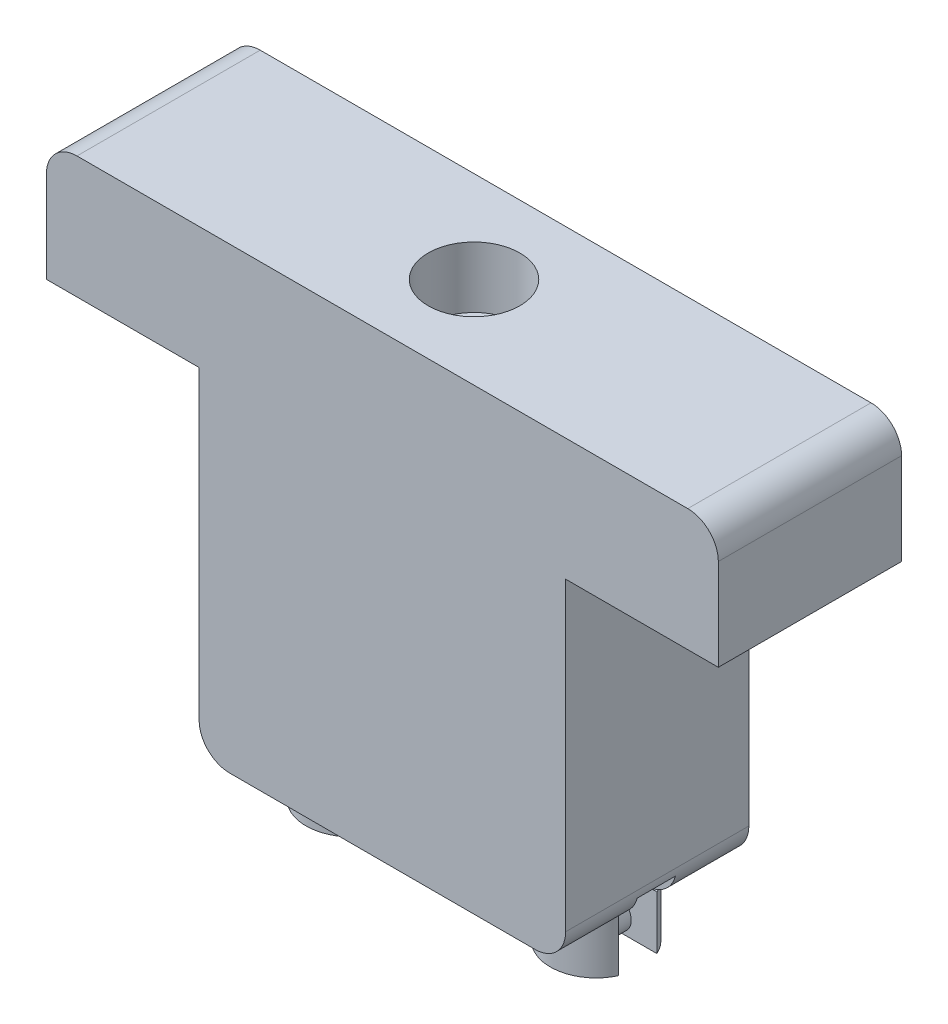
ISO-10303-21;
HEADER;
FILE_DESCRIPTION(('STEP AP214'),'2;1');
FILE_NAME('part.step','',(''),(''),'','','');
FILE_SCHEMA(('AUTOMOTIVE_DESIGN { 1 0 10303 214 1 1 1 1 }'));
ENDSEC;
DATA;
#1=APPLICATION_CONTEXT('core data for automotive mechanical design processes');
#2=APPLICATION_PROTOCOL_DEFINITION('international standard','automotive_design',2000,#1);
#3=PRODUCT_CONTEXT('',#1,'mechanical');
#4=PRODUCT('Part','Part','',(#3));
#5=PRODUCT_RELATED_PRODUCT_CATEGORY('part','',(#4));
#6=PRODUCT_DEFINITION_FORMATION('','',#4);
#7=PRODUCT_DEFINITION_CONTEXT('part definition',#1,'design');
#8=PRODUCT_DEFINITION('design','',#6,#7);
#9=PRODUCT_DEFINITION_SHAPE('','',#8);
#10=(LENGTH_UNIT() NAMED_UNIT(*) SI_UNIT(.MILLI.,.METRE.));
#11=(NAMED_UNIT(*) PLANE_ANGLE_UNIT() SI_UNIT($,.RADIAN.));
#12=(NAMED_UNIT(*) SI_UNIT($,.STERADIAN.) SOLID_ANGLE_UNIT());
#13=UNCERTAINTY_MEASURE_WITH_UNIT(LENGTH_MEASURE(1.E-05),#10,'distance_accuracy_value','');
#14=(GEOMETRIC_REPRESENTATION_CONTEXT(3) GLOBAL_UNCERTAINTY_ASSIGNED_CONTEXT((#13)) GLOBAL_UNIT_ASSIGNED_CONTEXT((#10,
#11,#12)) REPRESENTATION_CONTEXT('',''));
#15=CARTESIAN_POINT('',(0.,0.,0.));
#16=DIRECTION('',(0.,0.,1.));
#17=DIRECTION('',(1.,0.,0.));
#18=AXIS2_PLACEMENT_3D('',#15,#16,#17);
#19=CARTESIAN_POINT('',(-152.4,-190.5,152.4));
#20=DIRECTION('',(0.,1.,0.));
#21=DIRECTION('',(0.,0.,1.));
#22=AXIS2_PLACEMENT_3D('',#19,#20,#21);
#23=PLANE('',#22);
#24=DIRECTION('',(-1.,0.,0.));
#25=VECTOR('',#24,1.);
#26=CARTESIAN_POINT('',(-152.4,-190.5,92.075));
#27=LINE('',#26,#25);
#28=CARTESIAN_POINT('',(-40.1642981581466,-190.5,92.075));
#29=VERTEX_POINT('',#28);
#30=CARTESIAN_POINT('',(-66.9648390360316,-190.5,92.075));
#31=VERTEX_POINT('',#30);
#32=EDGE_CURVE('E294',#29,#31,#27,.T.);
#33=ORIENTED_EDGE('',*,*,#32,.F.);
#34=DIRECTION('',(0.,0.,1.));
#35=VECTOR('',#34,1.);
#36=CARTESIAN_POINT('',(-40.1642981581466,-190.5,152.4));
#37=LINE('',#36,#35);
#38=CARTESIAN_POINT('',(-40.1642981581466,-190.5,60.325));
#39=VERTEX_POINT('',#38);
#40=EDGE_CURVE('E564',#39,#29,#37,.T.);
#41=ORIENTED_EDGE('',*,*,#40,.F.);
#42=DIRECTION('',(1.,0.,0.));
#43=VECTOR('',#42,1.);
#44=CARTESIAN_POINT('',(-152.4,-190.5,60.325));
#45=LINE('',#44,#43);
#46=CARTESIAN_POINT('',(-66.9648390360316,-190.5,60.325));
#47=VERTEX_POINT('',#46);
#48=EDGE_CURVE('E265',#47,#39,#45,.T.);
#49=ORIENTED_EDGE('',*,*,#48,.F.);
#50=CARTESIAN_POINT('',(-101.6,-190.5,76.2));
#51=DIRECTION('',(0.,-1.,0.));
#52=DIRECTION('',(0.,0.,-1.));
#53=AXIS2_PLACEMENT_3D('',#50,#51,#52);
#54=CIRCLE('',#53,38.1);
#55=CARTESIAN_POINT('',(-127.,-190.5,47.8019366857526));
#56=VERTEX_POINT('',#55);
#57=EDGE_CURVE('E385',#56,#47,#54,.T.);
#58=ORIENTED_EDGE('',*,*,#57,.F.);
#59=DIRECTION('',(0.,0.,-1.));
#60=VECTOR('',#59,1.);
#61=CARTESIAN_POINT('',(-127.,-190.5,0.));
#62=LINE('',#61,#60);
#63=CARTESIAN_POINT('',(-127.,-190.5,0.));
#64=VERTEX_POINT('',#63);
#65=EDGE_CURVE('E519',#56,#64,#62,.T.);
#66=ORIENTED_EDGE('',*,*,#65,.T.);
#67=DIRECTION('',(1.,0.,0.));
#68=VECTOR('',#67,1.);
#69=CARTESIAN_POINT('',(-152.4,-190.5,0.));
#70=LINE('',#69,#68);
#71=CARTESIAN_POINT('',(127.,-190.5,0.));
#72=VERTEX_POINT('',#71);
#73=EDGE_CURVE('E452',#64,#72,#70,.T.);
#74=ORIENTED_EDGE('',*,*,#73,.T.);
#75=DIRECTION('',(0.,0.,-1.));
#76=VECTOR('',#75,1.);
#77=CARTESIAN_POINT('',(127.,-190.5,152.4));
#78=LINE('',#77,#76);
#79=CARTESIAN_POINT('',(127.,-190.5,47.8019366857526));
#80=VERTEX_POINT('',#79);
#81=EDGE_CURVE('E527',#72,#80,#78,.F.);
#82=ORIENTED_EDGE('',*,*,#81,.T.);
#83=CARTESIAN_POINT('',(101.6,-190.5,76.2));
#84=DIRECTION('',(0.,-1.,0.));
#85=DIRECTION('',(0.,0.,-1.));
#86=AXIS2_PLACEMENT_3D('',#83,#84,#85);
#87=CIRCLE('',#86,38.1);
#88=CARTESIAN_POINT('',(66.9648390360316,-190.5,60.325));
#89=VERTEX_POINT('',#88);
#90=EDGE_CURVE('E369',#89,#80,#87,.T.);
#91=ORIENTED_EDGE('',*,*,#90,.F.);
#92=DIRECTION('',(-1.,0.,0.));
#93=VECTOR('',#92,1.);
#94=CARTESIAN_POINT('',(-152.4,-190.5,60.325));
#95=LINE('',#94,#93);
#96=CARTESIAN_POINT('',(40.1642981581466,-190.5,60.325));
#97=VERTEX_POINT('',#96);
#98=EDGE_CURVE('E358',#89,#97,#95,.T.);
#99=ORIENTED_EDGE('',*,*,#98,.T.);
#100=DIRECTION('',(0.,0.,1.));
#101=VECTOR('',#100,1.);
#102=CARTESIAN_POINT('',(40.1642981581466,-190.5,152.4));
#103=LINE('',#102,#101);
#104=CARTESIAN_POINT('',(40.1642981581466,-190.5,92.075));
#105=VERTEX_POINT('',#104);
#106=EDGE_CURVE('E551',#97,#105,#103,.T.);
#107=ORIENTED_EDGE('',*,*,#106,.T.);
#108=DIRECTION('',(1.,0.,0.));
#109=VECTOR('',#108,1.);
#110=CARTESIAN_POINT('',(-152.4,-190.5,92.075));
#111=LINE('',#110,#109);
#112=CARTESIAN_POINT('',(66.9648390360316,-190.5,92.075));
#113=VERTEX_POINT('',#112);
#114=EDGE_CURVE('E330',#105,#113,#111,.T.);
#115=ORIENTED_EDGE('',*,*,#114,.T.);
#116=CARTESIAN_POINT('',(127.,-190.5,104.598063314247));
#117=VERTEX_POINT('',#116);
#118=EDGE_CURVE('E370',#117,#113,#87,.T.);
#119=ORIENTED_EDGE('',*,*,#118,.F.);
#120=CARTESIAN_POINT('',(127.,-190.5,152.4));
#121=VERTEX_POINT('',#120);
#122=EDGE_CURVE('E524',#117,#121,#78,.F.);
#123=ORIENTED_EDGE('',*,*,#122,.T.);
#124=DIRECTION('',(1.,0.,0.));
#125=VECTOR('',#124,1.);
#126=CARTESIAN_POINT('',(-152.4,-190.5,152.4));
#127=LINE('',#126,#125);
#128=CARTESIAN_POINT('',(-127.,-190.5,152.4));
#129=VERTEX_POINT('',#128);
#130=EDGE_CURVE('E456',#129,#121,#127,.T.);
#131=ORIENTED_EDGE('',*,*,#130,.F.);
#132=CARTESIAN_POINT('',(-127.,-190.5,104.598063314247));
#133=VERTEX_POINT('',#132);
#134=EDGE_CURVE('E520',#129,#133,#62,.T.);
#135=ORIENTED_EDGE('',*,*,#134,.T.);
#136=EDGE_CURVE('E367',#31,#133,#54,.T.);
#137=ORIENTED_EDGE('',*,*,#136,.F.);
#138=EDGE_LOOP('',(#33,#41,#49,#58,#66,#74,#82,#91,#99,#107,#115,#119,#123,#131,#135,#137));
#139=FACE_BOUND('',#138,.T.);
#140=ADVANCED_FACE('F47',(#139),#23,.F.);
#141=CARTESIAN_POINT('',(-127.,-165.1,152.4));
#142=DIRECTION('',(0.,0.,1.));
#143=DIRECTION('',(1.,0.,0.));
#144=AXIS2_PLACEMENT_3D('',#141,#142,#143);
#145=CYLINDRICAL_SURFACE('',#144,25.4);
#146=DIRECTION('',(0.,0.,1.));
#147=VECTOR('',#146,1.);
#148=CARTESIAN_POINT('',(-151.593444248417,-171.45,152.4));
#149=LINE('',#148,#147);
#150=CARTESIAN_POINT('',(-151.593444248417,-171.45,92.075));
#151=VERTEX_POINT('',#150);
#152=CARTESIAN_POINT('',(-151.593444248417,-171.45,60.325));
#153=VERTEX_POINT('',#152);
#154=EDGE_CURVE('E270',#151,#153,#149,.F.);
#155=ORIENTED_EDGE('',*,*,#154,.F.);
#156=CARTESIAN_POINT('',(-127.,-165.1,92.075));
#157=DIRECTION('',(0.,0.,-1.));
#158=DIRECTION('',(-1.,0.,0.));
#159=AXIS2_PLACEMENT_3D('',#156,#157,#158);
#160=CIRCLE('',#159,25.4);
#161=CARTESIAN_POINT('',(-127.,-190.5,92.075));
#162=VERTEX_POINT('',#161);
#163=EDGE_CURVE('E303',#151,#162,#160,.F.);
#164=ORIENTED_EDGE('',*,*,#163,.T.);
#165=EDGE_CURVE('E525',#133,#162,#62,.T.);
#166=ORIENTED_EDGE('',*,*,#165,.F.);
#167=ORIENTED_EDGE('',*,*,#134,.F.);
#168=CARTESIAN_POINT('',(-127.,-165.1,152.4));
#169=DIRECTION('',(0.,0.,1.));
#170=DIRECTION('',(1.,0.,0.));
#171=AXIS2_PLACEMENT_3D('',#168,#169,#170);
#172=CIRCLE('',#171,25.4);
#173=CARTESIAN_POINT('',(-152.4,-165.1,152.4));
#174=VERTEX_POINT('',#173);
#175=EDGE_CURVE('E531',#174,#129,#172,.T.);
#176=ORIENTED_EDGE('',*,*,#175,.F.);
#177=DIRECTION('',(0.,0.,-1.));
#178=VECTOR('',#177,1.);
#179=CARTESIAN_POINT('',(-152.4,-165.1,152.4));
#180=LINE('',#179,#178);
#181=CARTESIAN_POINT('',(-152.4,-165.1,0.));
#182=VERTEX_POINT('',#181);
#183=EDGE_CURVE('E539',#182,#174,#180,.F.);
#184=ORIENTED_EDGE('',*,*,#183,.F.);
#185=CARTESIAN_POINT('',(-127.,-165.1,0.));
#186=DIRECTION('',(0.,0.,1.));
#187=DIRECTION('',(1.,0.,0.));
#188=AXIS2_PLACEMENT_3D('',#185,#186,#187);
#189=CIRCLE('',#188,25.4);
#190=EDGE_CURVE('E513',#64,#182,#189,.F.);
#191=ORIENTED_EDGE('',*,*,#190,.F.);
#192=ORIENTED_EDGE('',*,*,#65,.F.);
#193=CARTESIAN_POINT('',(-127.,-190.5,60.325));
#194=VERTEX_POINT('',#193);
#195=EDGE_CURVE('E526',#194,#56,#62,.T.);
#196=ORIENTED_EDGE('',*,*,#195,.F.);
#197=CARTESIAN_POINT('',(-127.,-165.1,60.325));
#198=DIRECTION('',(0.,0.,1.));
#199=DIRECTION('',(1.,0.,0.));
#200=AXIS2_PLACEMENT_3D('',#197,#198,#199);
#201=CIRCLE('',#200,25.4);
#202=EDGE_CURVE('E283',#194,#153,#201,.F.);
#203=ORIENTED_EDGE('',*,*,#202,.T.);
#204=EDGE_LOOP('',(#155,#164,#166,#167,#176,#184,#191,#192,#196,#203));
#205=FACE_BOUND('',#204,.T.);
#206=ADVANCED_FACE('F49',(#205),#145,.T.);
#207=CARTESIAN_POINT('',(-101.6,-190.5,76.2));
#208=DIRECTION('',(0.,-1.,0.));
#209=DIRECTION('',(0.,0.,-1.));
#210=AXIS2_PLACEMENT_3D('',#207,#208,#209);
#211=PLANE('',#210);
#212=DIRECTION('',(1.,0.,0.));
#213=VECTOR('',#212,1.);
#214=CARTESIAN_POINT('',(-101.6,-190.5,92.075));
#215=LINE('',#214,#213);
#216=CARTESIAN_POINT('',(-136.235160963968,-190.5,92.075));
#217=VERTEX_POINT('',#216);
#218=EDGE_CURVE('E300',#217,#162,#215,.T.);
#219=ORIENTED_EDGE('',*,*,#218,.F.);
#220=EDGE_CURVE('E380',#133,#217,#54,.T.);
#221=ORIENTED_EDGE('',*,*,#220,.F.);
#222=ORIENTED_EDGE('',*,*,#165,.T.);
#223=EDGE_LOOP('',(#219,#221,#222));
#224=FACE_BOUND('',#223,.T.);
#225=ADVANCED_FACE('F602',(#224),#211,.F.);
#226=DIRECTION('',(-1.,0.,0.));
#227=VECTOR('',#226,1.);
#228=CARTESIAN_POINT('',(-101.6,-190.5,60.325));
#229=LINE('',#228,#227);
#230=CARTESIAN_POINT('',(-136.235160963968,-190.5,60.325));
#231=VERTEX_POINT('',#230);
#232=EDGE_CURVE('E280',#194,#231,#229,.T.);
#233=ORIENTED_EDGE('',*,*,#232,.F.);
#234=ORIENTED_EDGE('',*,*,#195,.T.);
#235=EDGE_CURVE('E384',#231,#56,#54,.T.);
#236=ORIENTED_EDGE('',*,*,#235,.F.);
#237=EDGE_LOOP('',(#233,#234,#236));
#238=FACE_BOUND('',#237,.T.);
#239=ADVANCED_FACE('F722',(#238),#211,.F.);
#240=CARTESIAN_POINT('',(-101.6,-234.95,76.2));
#241=DIRECTION('',(0.,1.,0.));
#242=DIRECTION('',(0.,0.,1.));
#243=AXIS2_PLACEMENT_3D('',#240,#241,#242);
#244=CYLINDRICAL_SURFACE('',#243,38.1);
#245=DIRECTION('',(0.,1.,0.));
#246=VECTOR('',#245,1.);
#247=CARTESIAN_POINT('',(-136.235160963968,-234.95,92.075));
#248=LINE('',#247,#246);
#249=CARTESIAN_POINT('',(-136.235160963968,-234.95,92.075));
#250=VERTEX_POINT('',#249);
#251=EDGE_CURVE('E297',#250,#217,#248,.T.);
#252=ORIENTED_EDGE('',*,*,#251,.F.);
#253=CARTESIAN_POINT('',(-101.6,-234.95,76.2));
#254=DIRECTION('',(0.,-1.,0.));
#255=DIRECTION('',(0.,0.,-1.));
#256=AXIS2_PLACEMENT_3D('',#253,#254,#255);
#257=CIRCLE('',#256,38.1);
#258=CARTESIAN_POINT('',(-66.9648390360316,-234.95,92.075));
#259=VERTEX_POINT('',#258);
#260=EDGE_CURVE('E379',#259,#250,#257,.T.);
#261=ORIENTED_EDGE('',*,*,#260,.F.);
#262=DIRECTION('',(0.,1.,0.));
#263=VECTOR('',#262,1.);
#264=CARTESIAN_POINT('',(-66.9648390360316,-234.95,92.075));
#265=LINE('',#264,#263);
#266=EDGE_CURVE('E291',#31,#259,#265,.F.);
#267=ORIENTED_EDGE('',*,*,#266,.F.);
#268=ORIENTED_EDGE('',*,*,#136,.T.);
#269=ORIENTED_EDGE('',*,*,#220,.T.);
#270=EDGE_LOOP('',(#252,#261,#267,#268,#269));
#271=FACE_BOUND('',#270,.T.);
#272=ADVANCED_FACE('F701',(#271),#244,.T.);
#273=DIRECTION('',(0.,1.,0.));
#274=VECTOR('',#273,1.);
#275=CARTESIAN_POINT('',(-66.9648390360316,-234.95,60.325));
#276=LINE('',#275,#274);
#277=CARTESIAN_POINT('',(-66.9648390360316,-234.95,60.325));
#278=VERTEX_POINT('',#277);
#279=EDGE_CURVE('E286',#278,#47,#276,.T.);
#280=ORIENTED_EDGE('',*,*,#279,.F.);
#281=CARTESIAN_POINT('',(-136.235160963968,-234.95,60.325));
#282=VERTEX_POINT('',#281);
#283=EDGE_CURVE('E375',#282,#278,#257,.T.);
#284=ORIENTED_EDGE('',*,*,#283,.F.);
#285=DIRECTION('',(0.,1.,0.));
#286=VECTOR('',#285,1.);
#287=CARTESIAN_POINT('',(-136.235160963968,-234.95,60.325));
#288=LINE('',#287,#286);
#289=EDGE_CURVE('E64',#231,#282,#288,.F.);
#290=ORIENTED_EDGE('',*,*,#289,.F.);
#291=ORIENTED_EDGE('',*,*,#235,.T.);
#292=ORIENTED_EDGE('',*,*,#57,.T.);
#293=EDGE_LOOP('',(#280,#284,#290,#291,#292));
#294=FACE_BOUND('',#293,.T.);
#295=ADVANCED_FACE('F714',(#294),#244,.T.);
#296=CARTESIAN_POINT('',(-101.6,-234.95,76.2));
#297=DIRECTION('',(0.,-1.,0.));
#298=DIRECTION('',(0.,0.,-1.));
#299=AXIS2_PLACEMENT_3D('',#296,#297,#298);
#300=PLANE('',#299);
#301=ORIENTED_EDGE('',*,*,#260,.T.);
#302=DIRECTION('',(1.,0.,0.));
#303=VECTOR('',#302,1.);
#304=CARTESIAN_POINT('',(-101.6,-234.95,92.075));
#305=LINE('',#304,#303);
#306=EDGE_CURVE('E558',#250,#259,#305,.T.);
#307=ORIENTED_EDGE('',*,*,#306,.T.);
#308=EDGE_LOOP('',(#301,#307));
#309=FACE_BOUND('',#308,.T.);
#310=ADVANCED_FACE('F727',(#309),#300,.T.);
#311=ORIENTED_EDGE('',*,*,#283,.T.);
#312=DIRECTION('',(-1.,0.,0.));
#313=VECTOR('',#312,1.);
#314=CARTESIAN_POINT('',(-101.6,-234.95,60.325));
#315=LINE('',#314,#313);
#316=EDGE_CURVE('E555',#278,#282,#315,.T.);
#317=ORIENTED_EDGE('',*,*,#316,.T.);
#318=EDGE_LOOP('',(#311,#317));
#319=FACE_BOUND('',#318,.T.);
#320=ADVANCED_FACE('F729',(#319),#300,.T.);
#321=CARTESIAN_POINT('',(101.6,-190.5,76.2));
#322=DIRECTION('',(0.,-1.,0.));
#323=DIRECTION('',(0.,0.,-1.));
#324=AXIS2_PLACEMENT_3D('',#321,#322,#323);
#325=PLANE('',#324);
#326=CARTESIAN_POINT('',(127.,-190.5,60.325));
#327=VERTEX_POINT('',#326);
#328=EDGE_CURVE('E532',#80,#327,#78,.F.);
#329=ORIENTED_EDGE('',*,*,#328,.T.);
#330=DIRECTION('',(1.,0.,0.));
#331=VECTOR('',#330,1.);
#332=CARTESIAN_POINT('',(101.6,-190.5,60.325));
#333=LINE('',#332,#331);
#334=CARTESIAN_POINT('',(136.235160963968,-190.5,60.325));
#335=VERTEX_POINT('',#334);
#336=EDGE_CURVE('E347',#327,#335,#333,.T.);
#337=ORIENTED_EDGE('',*,*,#336,.T.);
#338=EDGE_CURVE('E363',#80,#335,#87,.T.);
#339=ORIENTED_EDGE('',*,*,#338,.F.);
#340=EDGE_LOOP('',(#329,#337,#339));
#341=FACE_BOUND('',#340,.T.);
#342=ADVANCED_FACE('F639',(#341),#325,.F.);
#343=CARTESIAN_POINT('',(101.6,-234.95,76.2));
#344=DIRECTION('',(0.,1.,0.));
#345=DIRECTION('',(0.,0.,1.));
#346=AXIS2_PLACEMENT_3D('',#343,#344,#345);
#347=CYLINDRICAL_SURFACE('',#346,38.1);
#348=CARTESIAN_POINT('',(101.6,-234.95,76.2));
#349=DIRECTION('',(0.,-1.,0.));
#350=DIRECTION('',(0.,0.,-1.));
#351=AXIS2_PLACEMENT_3D('',#348,#349,#350);
#352=CIRCLE('',#351,38.1);
#353=CARTESIAN_POINT('',(66.9648390360316,-234.95,60.325));
#354=VERTEX_POINT('',#353);
#355=CARTESIAN_POINT('',(136.235160963968,-234.95,60.325));
#356=VERTEX_POINT('',#355);
#357=EDGE_CURVE('E362',#354,#356,#352,.T.);
#358=ORIENTED_EDGE('',*,*,#357,.F.);
#359=DIRECTION('',(0.,1.,0.));
#360=VECTOR('',#359,1.);
#361=CARTESIAN_POINT('',(66.9648390360316,-234.95,60.325));
#362=LINE('',#361,#360);
#363=EDGE_CURVE('E354',#354,#89,#362,.T.);
#364=ORIENTED_EDGE('',*,*,#363,.T.);
#365=ORIENTED_EDGE('',*,*,#90,.T.);
#366=ORIENTED_EDGE('',*,*,#338,.T.);
#367=DIRECTION('',(0.,1.,0.));
#368=VECTOR('',#367,1.);
#369=CARTESIAN_POINT('',(136.235160963968,-234.95,60.325));
#370=LINE('',#369,#368);
#371=EDGE_CURVE('E343',#335,#356,#370,.F.);
#372=ORIENTED_EDGE('',*,*,#371,.T.);
#373=EDGE_LOOP('',(#358,#364,#365,#366,#372));
#374=FACE_BOUND('',#373,.T.);
#375=ADVANCED_FACE('F826',(#374),#347,.T.);
#376=CARTESIAN_POINT('',(101.6,-234.95,76.2));
#377=DIRECTION('',(0.,-1.,0.));
#378=DIRECTION('',(0.,0.,-1.));
#379=AXIS2_PLACEMENT_3D('',#376,#377,#378);
#380=PLANE('',#379);
#381=DIRECTION('',(1.,0.,0.));
#382=VECTOR('',#381,1.);
#383=CARTESIAN_POINT('',(101.6,-234.95,60.325));
#384=LINE('',#383,#382);
#385=EDGE_CURVE('E545',#354,#356,#384,.T.);
#386=ORIENTED_EDGE('',*,*,#385,.F.);
#387=ORIENTED_EDGE('',*,*,#357,.T.);
#388=EDGE_LOOP('',(#386,#387));
#389=FACE_BOUND('',#388,.T.);
#390=ADVANCED_FACE('F779',(#389),#380,.T.);
#391=CARTESIAN_POINT('',(-152.4,-190.5,152.4));
#392=DIRECTION('',(-1.,0.,0.));
#393=DIRECTION('',(0.,0.,1.));
#394=AXIS2_PLACEMENT_3D('',#391,#392,#393);
#395=PLANE('',#394);
#396=DIRECTION('',(0.,1.,0.));
#397=VECTOR('',#396,1.);
#398=CARTESIAN_POINT('',(-152.4,-190.5,0.));
#399=LINE('',#398,#397);
#400=CARTESIAN_POINT('',(-152.4,88.9,0.));
#401=VERTEX_POINT('',#400);
#402=EDGE_CURVE('E461',#182,#401,#399,.T.);
#403=ORIENTED_EDGE('',*,*,#402,.F.);
#404=ORIENTED_EDGE('',*,*,#183,.T.);
#405=DIRECTION('',(0.,1.,0.));
#406=VECTOR('',#405,1.);
#407=CARTESIAN_POINT('',(-152.4,-190.5,152.4));
#408=LINE('',#407,#406);
#409=CARTESIAN_POINT('',(-152.4,88.9,152.4));
#410=VERTEX_POINT('',#409);
#411=EDGE_CURVE('E468',#174,#410,#408,.T.);
#412=ORIENTED_EDGE('',*,*,#411,.T.);
#413=DIRECTION('',(0.,0.,-1.));
#414=VECTOR('',#413,1.);
#415=CARTESIAN_POINT('',(-152.4,88.9,152.4));
#416=LINE('',#415,#414);
#417=EDGE_CURVE('E399',#410,#401,#416,.T.);
#418=ORIENTED_EDGE('',*,*,#417,.T.);
#419=EDGE_LOOP('',(#403,#404,#412,#418));
#420=FACE_BOUND('',#419,.T.);
#421=ADVANCED_FACE('F777',(#420),#395,.T.);
#422=CARTESIAN_POINT('',(152.4,-190.5,152.4));
#423=DIRECTION('',(-1.,0.,0.));
#424=DIRECTION('',(0.,0.,1.));
#425=AXIS2_PLACEMENT_3D('',#422,#423,#424);
#426=PLANE('',#425);
#427=DIRECTION('',(0.,1.,0.));
#428=VECTOR('',#427,1.);
#429=CARTESIAN_POINT('',(152.4,-190.5,152.4));
#430=LINE('',#429,#428);
#431=CARTESIAN_POINT('',(152.4,-165.1,152.4));
#432=VERTEX_POINT('',#431);
#433=CARTESIAN_POINT('',(152.4,88.9,152.4));
#434=VERTEX_POINT('',#433);
#435=EDGE_CURVE('E460',#432,#434,#430,.T.);
#436=ORIENTED_EDGE('',*,*,#435,.F.);
#437=DIRECTION('',(0.,0.,-1.));
#438=VECTOR('',#437,1.);
#439=CARTESIAN_POINT('',(152.4,-165.1,152.4));
#440=LINE('',#439,#438);
#441=CARTESIAN_POINT('',(152.4,-165.1,0.));
#442=VERTEX_POINT('',#441);
#443=EDGE_CURVE('E509',#432,#442,#440,.T.);
#444=ORIENTED_EDGE('',*,*,#443,.T.);
#445=DIRECTION('',(0.,1.,0.));
#446=VECTOR('',#445,1.);
#447=CARTESIAN_POINT('',(152.4,-190.5,0.));
#448=LINE('',#447,#446);
#449=CARTESIAN_POINT('',(152.4,88.9,0.));
#450=VERTEX_POINT('',#449);
#451=EDGE_CURVE('E475',#442,#450,#448,.T.);
#452=ORIENTED_EDGE('',*,*,#451,.T.);
#453=DIRECTION('',(0.,0.,-1.));
#454=VECTOR('',#453,1.);
#455=CARTESIAN_POINT('',(152.4,88.9,152.4));
#456=LINE('',#455,#454);
#457=EDGE_CURVE('E425',#434,#450,#456,.T.);
#458=ORIENTED_EDGE('',*,*,#457,.F.);
#459=EDGE_LOOP('',(#436,#444,#452,#458));
#460=FACE_BOUND('',#459,.T.);
#461=ADVANCED_FACE('F607',(#460),#426,.F.);
#462=CARTESIAN_POINT('',(-152.4,190.5,152.4));
#463=DIRECTION('',(0.,1.,0.));
#464=DIRECTION('',(0.,0.,1.));
#465=AXIS2_PLACEMENT_3D('',#462,#463,#464);
#466=PLANE('',#465);
#467=CARTESIAN_POINT('',(0.,190.5,76.2));
#468=DIRECTION('',(0.,1.,0.));
#469=DIRECTION('',(0.,0.,1.));
#470=AXIS2_PLACEMENT_3D('',#467,#468,#469);
#471=CIRCLE('',#470,38.1);
#472=CARTESIAN_POINT('',(0.,190.5,114.3));
#473=VERTEX_POINT('',#472);
#474=EDGE_CURVE('E447',#473,#473,#471,.T.);
#475=ORIENTED_EDGE('',*,*,#474,.F.);
#476=EDGE_LOOP('',(#475));
#477=FACE_BOUND('',#476,.T.);
#478=DIRECTION('',(1.,0.,0.));
#479=VECTOR('',#478,1.);
#480=CARTESIAN_POINT('',(-152.4,190.5,0.));
#481=LINE('',#480,#479);
#482=CARTESIAN_POINT('',(-254.,190.5,0.));
#483=VERTEX_POINT('',#482);
#484=CARTESIAN_POINT('',(254.,190.5,0.));
#485=VERTEX_POINT('',#484);
#486=EDGE_CURVE('E478',#483,#485,#481,.T.);
#487=ORIENTED_EDGE('',*,*,#486,.F.);
#488=DIRECTION('',(0.,0.,1.));
#489=VECTOR('',#488,1.);
#490=CARTESIAN_POINT('',(-254.,190.5,152.4));
#491=LINE('',#490,#489);
#492=CARTESIAN_POINT('',(-254.,190.5,152.4));
#493=VERTEX_POINT('',#492);
#494=EDGE_CURVE('E486',#483,#493,#491,.T.);
#495=ORIENTED_EDGE('',*,*,#494,.T.);
#496=DIRECTION('',(1.,0.,0.));
#497=VECTOR('',#496,1.);
#498=CARTESIAN_POINT('',(-152.4,190.5,152.4));
#499=LINE('',#498,#497);
#500=CARTESIAN_POINT('',(254.,190.5,152.4));
#501=VERTEX_POINT('',#500);
#502=EDGE_CURVE('E464',#493,#501,#499,.T.);
#503=ORIENTED_EDGE('',*,*,#502,.T.);
#504=DIRECTION('',(0.,0.,1.));
#505=VECTOR('',#504,1.);
#506=CARTESIAN_POINT('',(254.,190.5,152.4));
#507=LINE('',#506,#505);
#508=EDGE_CURVE('E471',#501,#485,#507,.F.);
#509=ORIENTED_EDGE('',*,*,#508,.T.);
#510=EDGE_LOOP('',(#487,#495,#503,#509));
#511=FACE_BOUND('',#510,.T.);
#512=ADVANCED_FACE('F677',(#477,#511),#466,.T.);
#513=CARTESIAN_POINT('',(0.,0.,152.4));
#514=DIRECTION('',(0.,0.,1.));
#515=DIRECTION('',(1.,0.,0.));
#516=AXIS2_PLACEMENT_3D('',#513,#514,#515);
#517=PLANE('',#516);
#518=ORIENTED_EDGE('',*,*,#130,.T.);
#519=CARTESIAN_POINT('',(127.,-165.1,152.4));
#520=DIRECTION('',(0.,0.,1.));
#521=DIRECTION('',(1.,0.,0.));
#522=AXIS2_PLACEMENT_3D('',#519,#520,#521);
#523=CIRCLE('',#522,25.4);
#524=EDGE_CURVE('E536',#121,#432,#523,.T.);
#525=ORIENTED_EDGE('',*,*,#524,.T.);
#526=ORIENTED_EDGE('',*,*,#435,.T.);
#527=DIRECTION('',(-1.,0.,0.));
#528=VECTOR('',#527,1.);
#529=CARTESIAN_POINT('',(279.4,88.9,152.4));
#530=LINE('',#529,#528);
#531=CARTESIAN_POINT('',(279.4,88.9,152.4));
#532=VERTEX_POINT('',#531);
#533=EDGE_CURVE('E443',#532,#434,#530,.T.);
#534=ORIENTED_EDGE('',*,*,#533,.F.);
#535=DIRECTION('',(0.,-1.,0.));
#536=VECTOR('',#535,1.);
#537=CARTESIAN_POINT('',(279.4,190.5,152.4));
#538=LINE('',#537,#536);
#539=CARTESIAN_POINT('',(279.4,165.1,152.4));
#540=VERTEX_POINT('',#539);
#541=EDGE_CURVE('E426',#540,#532,#538,.T.);
#542=ORIENTED_EDGE('',*,*,#541,.F.);
#543=CARTESIAN_POINT('',(254.,165.1,152.4));
#544=DIRECTION('',(0.,0.,1.));
#545=DIRECTION('',(1.,0.,0.));
#546=AXIS2_PLACEMENT_3D('',#543,#544,#545);
#547=CIRCLE('',#546,25.4);
#548=EDGE_CURVE('E490',#540,#501,#547,.T.);
#549=ORIENTED_EDGE('',*,*,#548,.T.);
#550=ORIENTED_EDGE('',*,*,#502,.F.);
#551=CARTESIAN_POINT('',(-254.,165.1,152.4));
#552=DIRECTION('',(0.,0.,1.));
#553=DIRECTION('',(1.,0.,0.));
#554=AXIS2_PLACEMENT_3D('',#551,#552,#553);
#555=CIRCLE('',#554,25.4);
#556=CARTESIAN_POINT('',(-279.4,165.1,152.4));
#557=VERTEX_POINT('',#556);
#558=EDGE_CURVE('E493',#493,#557,#555,.T.);
#559=ORIENTED_EDGE('',*,*,#558,.T.);
#560=DIRECTION('',(0.,-1.,0.));
#561=VECTOR('',#560,1.);
#562=CARTESIAN_POINT('',(-279.4,190.5,152.4));
#563=LINE('',#562,#561);
#564=CARTESIAN_POINT('',(-279.4,88.9,152.4));
#565=VERTEX_POINT('',#564);
#566=EDGE_CURVE('E403',#557,#565,#563,.T.);
#567=ORIENTED_EDGE('',*,*,#566,.T.);
#568=DIRECTION('',(1.,0.,0.));
#569=VECTOR('',#568,1.);
#570=CARTESIAN_POINT('',(-279.4,88.9,152.4));
#571=LINE('',#570,#569);
#572=EDGE_CURVE('E414',#565,#410,#571,.T.);
#573=ORIENTED_EDGE('',*,*,#572,.T.);
#574=ORIENTED_EDGE('',*,*,#411,.F.);
#575=ORIENTED_EDGE('',*,*,#175,.T.);
#576=EDGE_LOOP('',(#518,#525,#526,#534,#542,#549,#550,#559,#567,#573,#574,#575));
#577=FACE_BOUND('',#576,.T.);
#578=ADVANCED_FACE('F651',(#577),#517,.T.);
#579=CARTESIAN_POINT('',(0.,0.,0.));
#580=DIRECTION('',(0.,0.,1.));
#581=DIRECTION('',(1.,0.,0.));
#582=AXIS2_PLACEMENT_3D('',#579,#580,#581);
#583=PLANE('',#582);
#584=ORIENTED_EDGE('',*,*,#451,.F.);
#585=CARTESIAN_POINT('',(127.,-165.1,0.));
#586=DIRECTION('',(0.,0.,1.));
#587=DIRECTION('',(1.,0.,0.));
#588=AXIS2_PLACEMENT_3D('',#585,#586,#587);
#589=CIRCLE('',#588,25.4);
#590=EDGE_CURVE('E516',#442,#72,#589,.F.);
#591=ORIENTED_EDGE('',*,*,#590,.T.);
#592=ORIENTED_EDGE('',*,*,#73,.F.);
#593=ORIENTED_EDGE('',*,*,#190,.T.);
#594=ORIENTED_EDGE('',*,*,#402,.T.);
#595=DIRECTION('',(1.,0.,0.));
#596=VECTOR('',#595,1.);
#597=CARTESIAN_POINT('',(-279.4,88.9,0.));
#598=LINE('',#597,#596);
#599=CARTESIAN_POINT('',(-279.4,88.9,0.));
#600=VERTEX_POINT('',#599);
#601=EDGE_CURVE('E421',#600,#401,#598,.T.);
#602=ORIENTED_EDGE('',*,*,#601,.F.);
#603=DIRECTION('',(0.,1.,0.));
#604=VECTOR('',#603,1.);
#605=CARTESIAN_POINT('',(-279.4,190.5,0.));
#606=LINE('',#605,#604);
#607=CARTESIAN_POINT('',(-279.4,165.1,0.));
#608=VERTEX_POINT('',#607);
#609=EDGE_CURVE('E406',#600,#608,#606,.T.);
#610=ORIENTED_EDGE('',*,*,#609,.T.);
#611=CARTESIAN_POINT('',(-254.,165.1,0.));
#612=DIRECTION('',(0.,0.,1.));
#613=DIRECTION('',(1.,0.,0.));
#614=AXIS2_PLACEMENT_3D('',#611,#612,#613);
#615=CIRCLE('',#614,25.4);
#616=EDGE_CURVE('E502',#608,#483,#615,.F.);
#617=ORIENTED_EDGE('',*,*,#616,.T.);
#618=ORIENTED_EDGE('',*,*,#486,.T.);
#619=CARTESIAN_POINT('',(254.,165.1,0.));
#620=DIRECTION('',(0.,0.,1.));
#621=DIRECTION('',(1.,0.,0.));
#622=AXIS2_PLACEMENT_3D('',#619,#620,#621);
#623=CIRCLE('',#622,25.4);
#624=CARTESIAN_POINT('',(279.4,165.1,0.));
#625=VERTEX_POINT('',#624);
#626=EDGE_CURVE('E499',#485,#625,#623,.F.);
#627=ORIENTED_EDGE('',*,*,#626,.T.);
#628=DIRECTION('',(0.,1.,0.));
#629=VECTOR('',#628,1.);
#630=CARTESIAN_POINT('',(279.4,190.5,0.));
#631=LINE('',#630,#629);
#632=CARTESIAN_POINT('',(279.4,88.9,0.));
#633=VERTEX_POINT('',#632);
#634=EDGE_CURVE('E432',#633,#625,#631,.T.);
#635=ORIENTED_EDGE('',*,*,#634,.F.);
#636=DIRECTION('',(-1.,0.,0.));
#637=VECTOR('',#636,1.);
#638=CARTESIAN_POINT('',(279.4,88.9,0.));
#639=LINE('',#638,#637);
#640=EDGE_CURVE('E436',#633,#450,#639,.T.);
#641=ORIENTED_EDGE('',*,*,#640,.T.);
#642=EDGE_LOOP('',(#584,#591,#592,#593,#594,#602,#610,#617,#618,#627,#635,#641));
#643=FACE_BOUND('',#642,.T.);
#644=ADVANCED_FACE('F660',(#643),#583,.F.);
#645=CARTESIAN_POINT('',(0.,139.7,76.2));
#646=DIRECTION('',(0.,1.,0.));
#647=DIRECTION('',(0.,0.,1.));
#648=AXIS2_PLACEMENT_3D('',#645,#646,#647);
#649=CYLINDRICAL_SURFACE('',#648,38.1);
#650=CARTESIAN_POINT('',(0.,139.7,76.2));
#651=DIRECTION('',(0.,1.,0.));
#652=DIRECTION('',(0.,0.,1.));
#653=AXIS2_PLACEMENT_3D('',#650,#651,#652);
#654=CIRCLE('',#653,38.1);
#655=CARTESIAN_POINT('',(0.,139.7,114.3));
#656=VERTEX_POINT('',#655);
#657=EDGE_CURVE('E448',#656,#656,#654,.T.);
#658=ORIENTED_EDGE('',*,*,#657,.F.);
#659=EDGE_LOOP('',(#658));
#660=FACE_BOUND('',#659,.T.);
#661=ORIENTED_EDGE('',*,*,#474,.T.);
#662=EDGE_LOOP('',(#661));
#663=FACE_BOUND('',#662,.T.);
#664=ADVANCED_FACE('F768',(#660,#663),#649,.F.);
#665=CARTESIAN_POINT('',(0.,139.7,76.2));
#666=DIRECTION('',(0.,1.,0.));
#667=DIRECTION('',(0.,0.,1.));
#668=AXIS2_PLACEMENT_3D('',#665,#666,#667);
#669=PLANE('',#668);
#670=ORIENTED_EDGE('',*,*,#657,.T.);
#671=EDGE_LOOP('',(#670));
#672=FACE_BOUND('',#671,.T.);
#673=ADVANCED_FACE('F764',(#672),#669,.T.);
#674=CARTESIAN_POINT('',(279.4,88.9,152.4));
#675=DIRECTION('',(0.,1.,0.));
#676=DIRECTION('',(0.,0.,1.));
#677=AXIS2_PLACEMENT_3D('',#674,#675,#676);
#678=PLANE('',#677);
#679=CARTESIAN_POINT('',(228.6,88.9,76.2));
#680=DIRECTION('',(0.,-1.,0.));
#681=DIRECTION('',(0.,0.,-1.));
#682=AXIS2_PLACEMENT_3D('',#679,#680,#681);
#683=CIRCLE('',#682,25.4);
#684=CARTESIAN_POINT('',(228.6,88.9,50.7999999999999));
#685=VERTEX_POINT('',#684);
#686=EDGE_CURVE('E390',#685,#685,#683,.T.);
#687=ORIENTED_EDGE('',*,*,#686,.F.);
#688=EDGE_LOOP('',(#687));
#689=FACE_BOUND('',#688,.T.);
#690=ORIENTED_EDGE('',*,*,#457,.T.);
#691=ORIENTED_EDGE('',*,*,#640,.F.);
#692=DIRECTION('',(0.,0.,-1.));
#693=VECTOR('',#692,1.);
#694=CARTESIAN_POINT('',(279.4,88.9,152.4));
#695=LINE('',#694,#693);
#696=EDGE_CURVE('E429',#532,#633,#695,.T.);
#697=ORIENTED_EDGE('',*,*,#696,.F.);
#698=ORIENTED_EDGE('',*,*,#533,.T.);
#699=EDGE_LOOP('',(#690,#691,#697,#698));
#700=FACE_BOUND('',#699,.T.);
#701=ADVANCED_FACE('F666',(#689,#700),#678,.F.);
#702=CARTESIAN_POINT('',(279.4,0.,0.));
#703=DIRECTION('',(1.,0.,0.));
#704=DIRECTION('',(0.,0.,-1.));
#705=AXIS2_PLACEMENT_3D('',#702,#703,#704);
#706=PLANE('',#705);
#707=ORIENTED_EDGE('',*,*,#634,.T.);
#708=DIRECTION('',(0.,0.,1.));
#709=VECTOR('',#708,1.);
#710=CARTESIAN_POINT('',(279.4,165.1,0.));
#711=LINE('',#710,#709);
#712=EDGE_CURVE('E505',#625,#540,#711,.T.);
#713=ORIENTED_EDGE('',*,*,#712,.T.);
#714=ORIENTED_EDGE('',*,*,#541,.T.);
#715=ORIENTED_EDGE('',*,*,#696,.T.);
#716=EDGE_LOOP('',(#707,#713,#714,#715));
#717=FACE_BOUND('',#716,.T.);
#718=ADVANCED_FACE('F671',(#717),#706,.T.);
#719=CARTESIAN_POINT('',(-279.4,88.9,152.4));
#720=DIRECTION('',(0.,-1.,0.));
#721=DIRECTION('',(0.,0.,-1.));
#722=AXIS2_PLACEMENT_3D('',#719,#720,#721);
#723=PLANE('',#722);
#724=CARTESIAN_POINT('',(-228.6,88.9,76.2));
#725=DIRECTION('',(0.,1.,0.));
#726=DIRECTION('',(0.,0.,-1.));
#727=AXIS2_PLACEMENT_3D('',#724,#725,#726);
#728=CIRCLE('',#727,25.4);
#729=CARTESIAN_POINT('',(-228.6,88.9,50.7999999999999));
#730=VERTEX_POINT('',#729);
#731=EDGE_CURVE('E391',#730,#730,#728,.T.);
#732=ORIENTED_EDGE('',*,*,#731,.T.);
#733=EDGE_LOOP('',(#732));
#734=FACE_BOUND('',#733,.T.);
#735=ORIENTED_EDGE('',*,*,#417,.F.);
#736=ORIENTED_EDGE('',*,*,#572,.F.);
#737=DIRECTION('',(0.,0.,-1.));
#738=VECTOR('',#737,1.);
#739=CARTESIAN_POINT('',(-279.4,88.9,152.4));
#740=LINE('',#739,#738);
#741=EDGE_CURVE('E410',#565,#600,#740,.T.);
#742=ORIENTED_EDGE('',*,*,#741,.T.);
#743=ORIENTED_EDGE('',*,*,#601,.T.);
#744=EDGE_LOOP('',(#735,#736,#742,#743));
#745=FACE_BOUND('',#744,.T.);
#746=ADVANCED_FACE('F689',(#734,#745),#723,.T.);
#747=CARTESIAN_POINT('',(-279.4,0.,0.));
#748=DIRECTION('',(-1.,0.,0.));
#749=DIRECTION('',(0.,0.,-1.));
#750=AXIS2_PLACEMENT_3D('',#747,#748,#749);
#751=PLANE('',#750);
#752=ORIENTED_EDGE('',*,*,#566,.F.);
#753=DIRECTION('',(0.,0.,1.));
#754=VECTOR('',#753,1.);
#755=CARTESIAN_POINT('',(-279.4,165.1,0.));
#756=LINE('',#755,#754);
#757=EDGE_CURVE('E496',#557,#608,#756,.F.);
#758=ORIENTED_EDGE('',*,*,#757,.T.);
#759=ORIENTED_EDGE('',*,*,#609,.F.);
#760=ORIENTED_EDGE('',*,*,#741,.F.);
#761=EDGE_LOOP('',(#752,#758,#759,#760));
#762=FACE_BOUND('',#761,.T.);
#763=ADVANCED_FACE('F686',(#762),#751,.T.);
#764=CARTESIAN_POINT('',(228.6,139.7,76.2));
#765=DIRECTION('',(0.,-1.,0.));
#766=DIRECTION('',(0.,0.,-1.));
#767=AXIS2_PLACEMENT_3D('',#764,#765,#766);
#768=CYLINDRICAL_SURFACE('',#767,25.4);
#769=CARTESIAN_POINT('',(228.6,139.7,76.2));
#770=DIRECTION('',(0.,-1.,0.));
#771=DIRECTION('',(0.,0.,-1.));
#772=AXIS2_PLACEMENT_3D('',#769,#770,#771);
#773=CIRCLE('',#772,25.4);
#774=CARTESIAN_POINT('',(228.6,139.7,50.7999999999999));
#775=VERTEX_POINT('',#774);
#776=EDGE_CURVE('E395',#775,#775,#773,.T.);
#777=ORIENTED_EDGE('',*,*,#776,.F.);
#778=EDGE_LOOP('',(#777));
#779=FACE_BOUND('',#778,.T.);
#780=ORIENTED_EDGE('',*,*,#686,.T.);
#781=EDGE_LOOP('',(#780));
#782=FACE_BOUND('',#781,.T.);
#783=ADVANCED_FACE('F750',(#779,#782),#768,.F.);
#784=CARTESIAN_POINT('',(228.6,139.7,76.2));
#785=DIRECTION('',(0.,-1.,0.));
#786=DIRECTION('',(0.,0.,-1.));
#787=AXIS2_PLACEMENT_3D('',#784,#785,#786);
#788=PLANE('',#787);
#789=ORIENTED_EDGE('',*,*,#776,.T.);
#790=EDGE_LOOP('',(#789));
#791=FACE_BOUND('',#790,.T.);
#792=ADVANCED_FACE('F613',(#791),#788,.T.);
#793=CARTESIAN_POINT('',(-254.,165.1,152.4));
#794=DIRECTION('',(0.,0.,1.));
#795=DIRECTION('',(1.,0.,0.));
#796=AXIS2_PLACEMENT_3D('',#793,#794,#795);
#797=CYLINDRICAL_SURFACE('',#796,25.4);
#798=ORIENTED_EDGE('',*,*,#616,.F.);
#799=ORIENTED_EDGE('',*,*,#757,.F.);
#800=ORIENTED_EDGE('',*,*,#558,.F.);
#801=ORIENTED_EDGE('',*,*,#494,.F.);
#802=EDGE_LOOP('',(#798,#799,#800,#801));
#803=FACE_BOUND('',#802,.T.);
#804=ADVANCED_FACE('F609',(#803),#797,.T.);
#805=CARTESIAN_POINT('',(254.,165.1,0.));
#806=DIRECTION('',(0.,0.,1.));
#807=DIRECTION('',(1.,0.,0.));
#808=AXIS2_PLACEMENT_3D('',#805,#806,#807);
#809=CYLINDRICAL_SURFACE('',#808,25.4);
#810=ORIENTED_EDGE('',*,*,#626,.F.);
#811=ORIENTED_EDGE('',*,*,#508,.F.);
#812=ORIENTED_EDGE('',*,*,#548,.F.);
#813=ORIENTED_EDGE('',*,*,#712,.F.);
#814=EDGE_LOOP('',(#810,#811,#812,#813));
#815=FACE_BOUND('',#814,.T.);
#816=ADVANCED_FACE('F612',(#815),#809,.T.);
#817=CARTESIAN_POINT('',(127.,-165.1,152.4));
#818=DIRECTION('',(0.,0.,-1.));
#819=DIRECTION('',(-1.,0.,0.));
#820=AXIS2_PLACEMENT_3D('',#817,#818,#819);
#821=CYLINDRICAL_SURFACE('',#820,25.4);
#822=CARTESIAN_POINT('',(127.,-165.1,60.325));
#823=DIRECTION('',(0.,0.,-1.));
#824=DIRECTION('',(-1.,0.,0.));
#825=AXIS2_PLACEMENT_3D('',#822,#823,#824);
#826=CIRCLE('',#825,25.4);
#827=CARTESIAN_POINT('',(151.593444248417,-171.45,60.325));
#828=VERTEX_POINT('',#827);
#829=EDGE_CURVE('E351',#327,#828,#826,.F.);
#830=ORIENTED_EDGE('',*,*,#829,.F.);
#831=ORIENTED_EDGE('',*,*,#328,.F.);
#832=ORIENTED_EDGE('',*,*,#81,.F.);
#833=ORIENTED_EDGE('',*,*,#590,.F.);
#834=ORIENTED_EDGE('',*,*,#443,.F.);
#835=ORIENTED_EDGE('',*,*,#524,.F.);
#836=ORIENTED_EDGE('',*,*,#122,.F.);
#837=CARTESIAN_POINT('',(127.,-190.5,92.075));
#838=VERTEX_POINT('',#837);
#839=EDGE_CURVE('E533',#838,#117,#78,.F.);
#840=ORIENTED_EDGE('',*,*,#839,.F.);
#841=CARTESIAN_POINT('',(127.,-165.1,92.075));
#842=DIRECTION('',(0.,0.,1.));
#843=DIRECTION('',(1.,0.,0.));
#844=AXIS2_PLACEMENT_3D('',#841,#842,#843);
#845=CIRCLE('',#844,25.4);
#846=CARTESIAN_POINT('',(151.593444248417,-171.45,92.075));
#847=VERTEX_POINT('',#846);
#848=EDGE_CURVE('E340',#847,#838,#845,.F.);
#849=ORIENTED_EDGE('',*,*,#848,.F.);
#850=DIRECTION('',(0.,0.,-1.));
#851=VECTOR('',#850,1.);
#852=CARTESIAN_POINT('',(151.593444248417,-171.45,152.4));
#853=LINE('',#852,#851);
#854=EDGE_CURVE('E548',#828,#847,#853,.F.);
#855=ORIENTED_EDGE('',*,*,#854,.F.);
#856=EDGE_LOOP('',(#830,#831,#832,#833,#834,#835,#836,#840,#849,#855));
#857=FACE_BOUND('',#856,.T.);
#858=ADVANCED_FACE('F616',(#857),#821,.T.);
#859=CARTESIAN_POINT('',(-228.6,139.7,76.2));
#860=DIRECTION('',(0.,-1.,0.));
#861=DIRECTION('',(0.,0.,-1.));
#862=AXIS2_PLACEMENT_3D('',#859,#860,#861);
#863=CYLINDRICAL_SURFACE('',#862,25.4);
#864=CARTESIAN_POINT('',(-228.6,139.7,76.2));
#865=DIRECTION('',(0.,1.,0.));
#866=DIRECTION('',(0.,0.,-1.));
#867=AXIS2_PLACEMENT_3D('',#864,#865,#866);
#868=CIRCLE('',#867,25.4);
#869=CARTESIAN_POINT('',(-228.6,139.7,50.7999999999999));
#870=VERTEX_POINT('',#869);
#871=EDGE_CURVE('E386',#870,#870,#868,.T.);
#872=ORIENTED_EDGE('',*,*,#871,.T.);
#873=EDGE_LOOP('',(#872));
#874=FACE_BOUND('',#873,.T.);
#875=ORIENTED_EDGE('',*,*,#731,.F.);
#876=EDGE_LOOP('',(#875));
#877=FACE_BOUND('',#876,.T.);
#878=ADVANCED_FACE('F619',(#874,#877),#863,.F.);
#879=CARTESIAN_POINT('',(-228.6,139.7,76.2));
#880=DIRECTION('',(0.,-1.,0.));
#881=DIRECTION('',(0.,0.,-1.));
#882=AXIS2_PLACEMENT_3D('',#879,#880,#881);
#883=PLANE('',#882);
#884=ORIENTED_EDGE('',*,*,#871,.F.);
#885=EDGE_LOOP('',(#884));
#886=FACE_BOUND('',#885,.T.);
#887=ADVANCED_FACE('F626',(#886),#883,.T.);
#888=CARTESIAN_POINT('',(136.235160963968,-190.5,92.075));
#889=VERTEX_POINT('',#888);
#890=EDGE_CURVE('E368',#889,#117,#87,.T.);
#891=ORIENTED_EDGE('',*,*,#890,.F.);
#892=DIRECTION('',(-1.,0.,0.));
#893=VECTOR('',#892,1.);
#894=CARTESIAN_POINT('',(101.6,-190.5,92.075));
#895=LINE('',#894,#893);
#896=EDGE_CURVE('E336',#889,#838,#895,.T.);
#897=ORIENTED_EDGE('',*,*,#896,.T.);
#898=ORIENTED_EDGE('',*,*,#839,.T.);
#899=EDGE_LOOP('',(#891,#897,#898));
#900=FACE_BOUND('',#899,.T.);
#901=ADVANCED_FACE('F745',(#900),#325,.F.);
#902=CARTESIAN_POINT('',(136.235160963968,-234.95,92.075));
#903=VERTEX_POINT('',#902);
#904=CARTESIAN_POINT('',(66.9648390360316,-234.95,92.075));
#905=VERTEX_POINT('',#904);
#906=EDGE_CURVE('E374',#903,#905,#352,.T.);
#907=ORIENTED_EDGE('',*,*,#906,.F.);
#908=DIRECTION('',(0.,1.,0.));
#909=VECTOR('',#908,1.);
#910=CARTESIAN_POINT('',(136.235160963968,-234.95,92.075));
#911=LINE('',#910,#909);
#912=EDGE_CURVE('E72',#903,#889,#911,.T.);
#913=ORIENTED_EDGE('',*,*,#912,.T.);
#914=ORIENTED_EDGE('',*,*,#890,.T.);
#915=ORIENTED_EDGE('',*,*,#118,.T.);
#916=DIRECTION('',(0.,1.,0.));
#917=VECTOR('',#916,1.);
#918=CARTESIAN_POINT('',(66.9648390360316,-234.95,92.075));
#919=LINE('',#918,#917);
#920=EDGE_CURVE('E323',#113,#905,#919,.F.);
#921=ORIENTED_EDGE('',*,*,#920,.T.);
#922=EDGE_LOOP('',(#907,#913,#914,#915,#921));
#923=FACE_BOUND('',#922,.T.);
#924=ADVANCED_FACE('F834',(#923),#347,.T.);
#925=DIRECTION('',(-1.,0.,0.));
#926=VECTOR('',#925,1.);
#927=CARTESIAN_POINT('',(101.6,-234.95,92.075));
#928=LINE('',#927,#926);
#929=EDGE_CURVE('E542',#903,#905,#928,.T.);
#930=ORIENTED_EDGE('',*,*,#929,.F.);
#931=ORIENTED_EDGE('',*,*,#906,.T.);
#932=EDGE_LOOP('',(#930,#931));
#933=FACE_BOUND('',#932,.T.);
#934=ADVANCED_FACE('F739',(#933),#380,.T.);
#935=CARTESIAN_POINT('',(40.1642981581466,-171.45,60.325));
#936=DIRECTION('',(-1.,0.,0.));
#937=DIRECTION('',(0.,0.,1.));
#938=AXIS2_PLACEMENT_3D('',#935,#936,#937);
#939=PLANE('',#938);
#940=DIRECTION('',(0.,-1.,0.));
#941=VECTOR('',#940,1.);
#942=CARTESIAN_POINT('',(40.1642981581466,-171.45,60.325));
#943=LINE('',#942,#941);
#944=CARTESIAN_POINT('',(40.1642981581466,-171.45,60.325));
#945=VERTEX_POINT('',#944);
#946=EDGE_CURVE('E319',#945,#97,#943,.T.);
#947=ORIENTED_EDGE('',*,*,#946,.F.);
#948=DIRECTION('',(0.,0.,-1.));
#949=VECTOR('',#948,1.);
#950=CARTESIAN_POINT('',(40.1642981581466,-171.45,60.325));
#951=LINE('',#950,#949);
#952=CARTESIAN_POINT('',(40.1642981581466,-171.45,92.075));
#953=VERTEX_POINT('',#952);
#954=EDGE_CURVE('E310',#953,#945,#951,.T.);
#955=ORIENTED_EDGE('',*,*,#954,.F.);
#956=DIRECTION('',(0.,-1.,0.));
#957=VECTOR('',#956,1.);
#958=CARTESIAN_POINT('',(40.1642981581466,-171.45,92.075));
#959=LINE('',#958,#957);
#960=EDGE_CURVE('E318',#953,#105,#959,.T.);
#961=ORIENTED_EDGE('',*,*,#960,.T.);
#962=ORIENTED_EDGE('',*,*,#106,.F.);
#963=EDGE_LOOP('',(#947,#955,#961,#962));
#964=FACE_BOUND('',#963,.T.);
#965=ADVANCED_FACE('F849',(#964),#939,.F.);
#966=CARTESIAN_POINT('',(40.1642981581466,-171.45,60.325));
#967=DIRECTION('',(0.,0.,-1.));
#968=DIRECTION('',(-1.,0.,0.));
#969=AXIS2_PLACEMENT_3D('',#966,#967,#968);
#970=PLANE('',#969);
#971=CARTESIAN_POINT('',(102.203286199221,-221.696968447896,60.325));
#972=DIRECTION('',(0.,0.,-1.));
#973=DIRECTION('',(-1.,0.,0.));
#974=AXIS2_PLACEMENT_3D('',#971,#972,#973);
#975=CIRCLE('',#974,12.7);
#976=CARTESIAN_POINT('',(89.5032861992209,-221.696968447896,60.325));
#977=VERTEX_POINT('',#976);
#978=EDGE_CURVE('E570',#977,#977,#975,.F.);
#979=ORIENTED_EDGE('',*,*,#978,.F.);
#980=EDGE_LOOP('',(#979));
#981=FACE_BOUND('',#980,.T.);
#982=ORIENTED_EDGE('',*,*,#363,.F.);
#983=ORIENTED_EDGE('',*,*,#385,.T.);
#984=ORIENTED_EDGE('',*,*,#371,.F.);
#985=ORIENTED_EDGE('',*,*,#336,.F.);
#986=ORIENTED_EDGE('',*,*,#829,.T.);
#987=DIRECTION('',(1.,0.,0.));
#988=VECTOR('',#987,1.);
#989=CARTESIAN_POINT('',(40.1642981581466,-171.45,60.325));
#990=LINE('',#989,#988);
#991=EDGE_CURVE('E314',#945,#828,#990,.T.);
#992=ORIENTED_EDGE('',*,*,#991,.F.);
#993=ORIENTED_EDGE('',*,*,#946,.T.);
#994=ORIENTED_EDGE('',*,*,#98,.F.);
#995=EDGE_LOOP('',(#982,#983,#984,#985,#986,#992,#993,#994));
#996=FACE_BOUND('',#995,.T.);
#997=ADVANCED_FACE('F958',(#981,#996),#970,.F.);
#998=CARTESIAN_POINT('',(40.1642981581466,-171.45,92.075));
#999=DIRECTION('',(0.,0.,1.));
#1000=DIRECTION('',(1.,0.,0.));
#1001=AXIS2_PLACEMENT_3D('',#998,#999,#1000);
#1002=PLANE('',#1001);
#1003=CARTESIAN_POINT('',(102.203286199221,-221.696968447896,92.075));
#1004=DIRECTION('',(0.,0.,1.));
#1005=DIRECTION('',(1.,0.,0.));
#1006=AXIS2_PLACEMENT_3D('',#1003,#1004,#1005);
#1007=CIRCLE('',#1006,12.7);
#1008=CARTESIAN_POINT('',(114.903286199221,-221.696968447896,92.075));
#1009=VERTEX_POINT('',#1008);
#1010=EDGE_CURVE('E567',#1009,#1009,#1007,.F.);
#1011=ORIENTED_EDGE('',*,*,#1010,.F.);
#1012=EDGE_LOOP('',(#1011));
#1013=FACE_BOUND('',#1012,.T.);
#1014=ORIENTED_EDGE('',*,*,#848,.T.);
#1015=ORIENTED_EDGE('',*,*,#896,.F.);
#1016=ORIENTED_EDGE('',*,*,#912,.F.);
#1017=ORIENTED_EDGE('',*,*,#929,.T.);
#1018=ORIENTED_EDGE('',*,*,#920,.F.);
#1019=ORIENTED_EDGE('',*,*,#114,.F.);
#1020=ORIENTED_EDGE('',*,*,#960,.F.);
#1021=DIRECTION('',(-1.,0.,0.));
#1022=VECTOR('',#1021,1.);
#1023=CARTESIAN_POINT('',(40.1642981581466,-171.45,92.075));
#1024=LINE('',#1023,#1022);
#1025=EDGE_CURVE('E307',#847,#953,#1024,.T.);
#1026=ORIENTED_EDGE('',*,*,#1025,.F.);
#1027=EDGE_LOOP('',(#1014,#1015,#1016,#1017,#1018,#1019,#1020,#1026));
#1028=FACE_BOUND('',#1027,.T.);
#1029=ADVANCED_FACE('F967',(#1013,#1028),#1002,.F.);
#1030=CARTESIAN_POINT('',(0.,-171.45,0.));
#1031=DIRECTION('',(0.,1.,0.));
#1032=DIRECTION('',(0.,0.,1.));
#1033=AXIS2_PLACEMENT_3D('',#1030,#1031,#1032);
#1034=PLANE('',#1033);
#1035=ORIENTED_EDGE('',*,*,#854,.T.);
#1036=ORIENTED_EDGE('',*,*,#1025,.T.);
#1037=ORIENTED_EDGE('',*,*,#954,.T.);
#1038=ORIENTED_EDGE('',*,*,#991,.T.);
#1039=EDGE_LOOP('',(#1035,#1036,#1037,#1038));
#1040=FACE_BOUND('',#1039,.T.);
#1041=ADVANCED_FACE('F964',(#1040),#1034,.F.);
#1042=CARTESIAN_POINT('',(-40.1642981581466,-171.45,60.325));
#1043=DIRECTION('',(-1.,0.,0.));
#1044=DIRECTION('',(0.,0.,1.));
#1045=AXIS2_PLACEMENT_3D('',#1042,#1043,#1044);
#1046=PLANE('',#1045);
#1047=ORIENTED_EDGE('',*,*,#40,.T.);
#1048=DIRECTION('',(0.,-1.,0.));
#1049=VECTOR('',#1048,1.);
#1050=CARTESIAN_POINT('',(-40.1642981581466,-171.45,92.075));
#1051=LINE('',#1050,#1049);
#1052=CARTESIAN_POINT('',(-40.1642981581466,-171.45,92.075));
#1053=VERTEX_POINT('',#1052);
#1054=EDGE_CURVE('E253',#1053,#29,#1051,.T.);
#1055=ORIENTED_EDGE('',*,*,#1054,.F.);
#1056=DIRECTION('',(0.,0.,-1.));
#1057=VECTOR('',#1056,1.);
#1058=CARTESIAN_POINT('',(-40.1642981581466,-171.45,60.325));
#1059=LINE('',#1058,#1057);
#1060=CARTESIAN_POINT('',(-40.1642981581466,-171.45,60.325));
#1061=VERTEX_POINT('',#1060);
#1062=EDGE_CURVE('E247',#1053,#1061,#1059,.T.);
#1063=ORIENTED_EDGE('',*,*,#1062,.T.);
#1064=DIRECTION('',(0.,-1.,0.));
#1065=VECTOR('',#1064,1.);
#1066=CARTESIAN_POINT('',(-40.1642981581466,-171.45,60.325));
#1067=LINE('',#1066,#1065);
#1068=EDGE_CURVE('E250',#1061,#39,#1067,.T.);
#1069=ORIENTED_EDGE('',*,*,#1068,.T.);
#1070=EDGE_LOOP('',(#1047,#1055,#1063,#1069));
#1071=FACE_BOUND('',#1070,.T.);
#1072=ADVANCED_FACE('F249',(#1071),#1046,.T.);
#1073=CARTESIAN_POINT('',(-40.1642981581466,-171.45,92.075));
#1074=DIRECTION('',(0.,0.,-1.));
#1075=DIRECTION('',(-1.,0.,0.));
#1076=AXIS2_PLACEMENT_3D('',#1073,#1074,#1075);
#1077=PLANE('',#1076);
#1078=CARTESIAN_POINT('',(-102.203286199221,-221.696968447896,92.075));
#1079=DIRECTION('',(0.,0.,-1.));
#1080=DIRECTION('',(-1.,0.,0.));
#1081=AXIS2_PLACEMENT_3D('',#1078,#1079,#1080);
#1082=CIRCLE('',#1081,12.7);
#1083=CARTESIAN_POINT('',(-114.903286199221,-221.696968447896,92.075));
#1084=VERTEX_POINT('',#1083);
#1085=EDGE_CURVE('E11',#1084,#1084,#1082,.T.);
#1086=ORIENTED_EDGE('',*,*,#1085,.F.);
#1087=EDGE_LOOP('',(#1086));
#1088=FACE_BOUND('',#1087,.T.);
#1089=DIRECTION('',(1.,0.,0.));
#1090=VECTOR('',#1089,1.);
#1091=CARTESIAN_POINT('',(-40.1642981581466,-171.45,92.075));
#1092=LINE('',#1091,#1090);
#1093=EDGE_CURVE('E258',#151,#1053,#1092,.T.);
#1094=ORIENTED_EDGE('',*,*,#1093,.T.);
#1095=ORIENTED_EDGE('',*,*,#1054,.T.);
#1096=ORIENTED_EDGE('',*,*,#32,.T.);
#1097=ORIENTED_EDGE('',*,*,#266,.T.);
#1098=ORIENTED_EDGE('',*,*,#306,.F.);
#1099=ORIENTED_EDGE('',*,*,#251,.T.);
#1100=ORIENTED_EDGE('',*,*,#218,.T.);
#1101=ORIENTED_EDGE('',*,*,#163,.F.);
#1102=EDGE_LOOP('',(#1094,#1095,#1096,#1097,#1098,#1099,#1100,#1101));
#1103=FACE_BOUND('',#1102,.T.);
#1104=ADVANCED_FACE('F582',(#1088,#1103),#1077,.T.);
#1105=CARTESIAN_POINT('',(-40.1642981581466,-171.45,60.325));
#1106=DIRECTION('',(0.,0.,1.));
#1107=DIRECTION('',(1.,0.,0.));
#1108=AXIS2_PLACEMENT_3D('',#1105,#1106,#1107);
#1109=PLANE('',#1108);
#1110=CARTESIAN_POINT('',(-102.203286199221,-221.696968447896,60.325));
#1111=DIRECTION('',(0.,0.,1.));
#1112=DIRECTION('',(1.,0.,0.));
#1113=AXIS2_PLACEMENT_3D('',#1110,#1111,#1112);
#1114=CIRCLE('',#1113,12.7);
#1115=CARTESIAN_POINT('',(-89.5032861992209,-221.696968447896,60.325));
#1116=VERTEX_POINT('',#1115);
#1117=EDGE_CURVE('E51',#1116,#1116,#1114,.T.);
#1118=ORIENTED_EDGE('',*,*,#1117,.F.);
#1119=EDGE_LOOP('',(#1118));
#1120=FACE_BOUND('',#1119,.T.);
#1121=ORIENTED_EDGE('',*,*,#48,.T.);
#1122=ORIENTED_EDGE('',*,*,#1068,.F.);
#1123=DIRECTION('',(-1.,0.,0.));
#1124=VECTOR('',#1123,1.);
#1125=CARTESIAN_POINT('',(-40.1642981581466,-171.45,60.325));
#1126=LINE('',#1125,#1124);
#1127=EDGE_CURVE('E259',#1061,#153,#1126,.T.);
#1128=ORIENTED_EDGE('',*,*,#1127,.T.);
#1129=ORIENTED_EDGE('',*,*,#202,.F.);
#1130=ORIENTED_EDGE('',*,*,#232,.T.);
#1131=ORIENTED_EDGE('',*,*,#289,.T.);
#1132=ORIENTED_EDGE('',*,*,#316,.F.);
#1133=ORIENTED_EDGE('',*,*,#279,.T.);
#1134=EDGE_LOOP('',(#1121,#1122,#1128,#1129,#1130,#1131,#1132,#1133));
#1135=FACE_BOUND('',#1134,.T.);
#1136=ADVANCED_FACE('F262',(#1120,#1135),#1109,.T.);
#1137=CARTESIAN_POINT('',(0.,-171.45,0.));
#1138=DIRECTION('',(0.,1.,0.));
#1139=DIRECTION('',(0.,0.,1.));
#1140=AXIS2_PLACEMENT_3D('',#1137,#1138,#1139);
#1141=PLANE('',#1140);
#1142=ORIENTED_EDGE('',*,*,#154,.T.);
#1143=ORIENTED_EDGE('',*,*,#1127,.F.);
#1144=ORIENTED_EDGE('',*,*,#1062,.F.);
#1145=ORIENTED_EDGE('',*,*,#1093,.F.);
#1146=EDGE_LOOP('',(#1142,#1143,#1144,#1145));
#1147=FACE_BOUND('',#1146,.T.);
#1148=ADVANCED_FACE('F268',(#1147),#1141,.F.);
#1149=CARTESIAN_POINT('',(102.203286199221,-221.696968447896,93.091));
#1150=DIRECTION('',(0.,0.,-1.));
#1151=DIRECTION('',(-1.,0.,0.));
#1152=AXIS2_PLACEMENT_3D('',#1149,#1150,#1151);
#1153=CYLINDRICAL_SURFACE('',#1152,12.7);
#1154=ORIENTED_EDGE('',*,*,#978,.T.);
#1155=EDGE_LOOP('',(#1154));
#1156=FACE_BOUND('',#1155,.T.);
#1157=ORIENTED_EDGE('',*,*,#1010,.T.);
#1158=EDGE_LOOP('',(#1157));
#1159=FACE_BOUND('',#1158,.T.);
#1160=ADVANCED_FACE('F589',(#1156,#1159),#1153,.T.);
#1161=CARTESIAN_POINT('',(-102.203286199221,-221.696968447896,93.091));
#1162=DIRECTION('',(0.,0.,-1.));
#1163=DIRECTION('',(-1.,0.,0.));
#1164=AXIS2_PLACEMENT_3D('',#1161,#1162,#1163);
#1165=CYLINDRICAL_SURFACE('',#1164,12.7);
#1166=ORIENTED_EDGE('',*,*,#1085,.T.);
#1167=EDGE_LOOP('',(#1166));
#1168=FACE_BOUND('',#1167,.T.);
#1169=ORIENTED_EDGE('',*,*,#1117,.T.);
#1170=EDGE_LOOP('',(#1169));
#1171=FACE_BOUND('',#1170,.T.);
#1172=ADVANCED_FACE('F579',(#1168,#1171),#1165,.T.);
#1173=CLOSED_SHELL('',(#140,#206,#225,#239,#272,#295,#310,#320,#342,#375,#390,#421,#461,#512,
#578,#644,#664,#673,#701,#718,#746,#763,#783,#792,#804,#816,#858,#878,#887,#901,#924,#934,#965,
#997,#1029,#1041,#1072,#1104,#1136,#1148,#1160,#1172));
#1174=MANIFOLD_SOLID_BREP('B2',#1173);
#1175=ADVANCED_BREP_SHAPE_REPRESENTATION('',(#18,#1174),#14);
#1176=SHAPE_DEFINITION_REPRESENTATION(#9,#1175);
ENDSEC;
END-ISO-10303-21;
